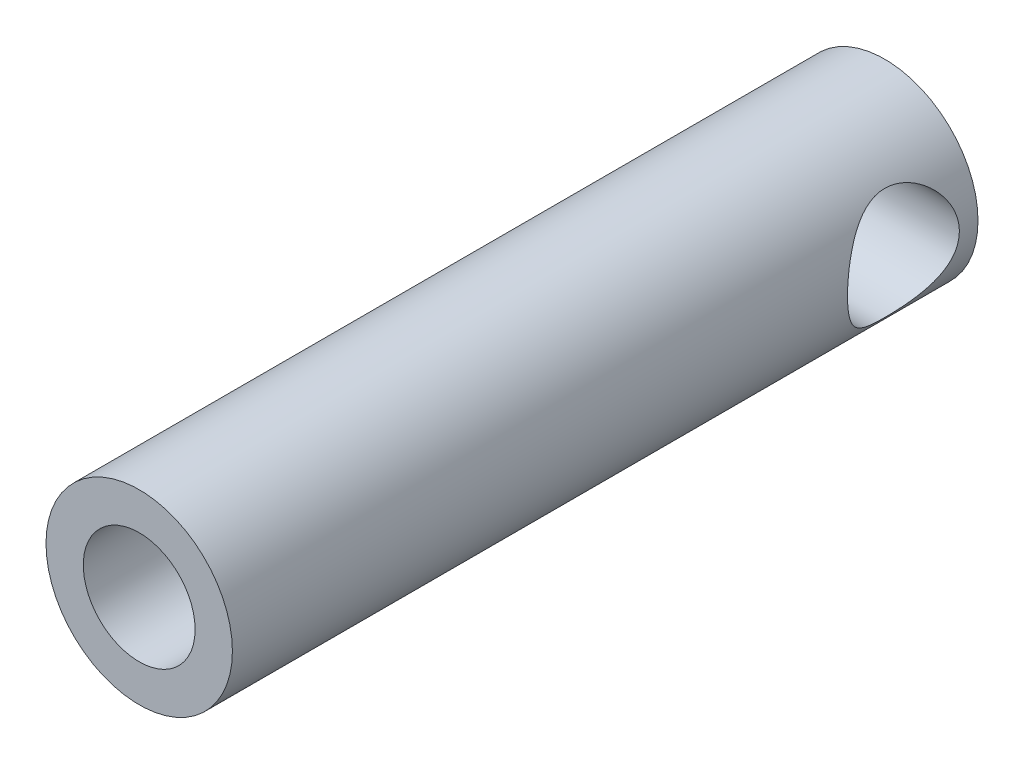
ISO-10303-21;
HEADER;
FILE_DESCRIPTION(('STEP AP214'),'2;1');
FILE_NAME('part.step','',(''),(''),'','','');
FILE_SCHEMA(('AUTOMOTIVE_DESIGN { 1 0 10303 214 1 1 1 1 }'));
ENDSEC;
DATA;
#1=APPLICATION_CONTEXT('core data for automotive mechanical design processes');
#2=APPLICATION_PROTOCOL_DEFINITION('international standard','automotive_design',2000,#1);
#3=PRODUCT_CONTEXT('',#1,'mechanical');
#4=PRODUCT('Part','Part','',(#3));
#5=PRODUCT_RELATED_PRODUCT_CATEGORY('part','',(#4));
#6=PRODUCT_DEFINITION_FORMATION('','',#4);
#7=PRODUCT_DEFINITION_CONTEXT('part definition',#1,'design');
#8=PRODUCT_DEFINITION('design','',#6,#7);
#9=PRODUCT_DEFINITION_SHAPE('','',#8);
#10=(LENGTH_UNIT() NAMED_UNIT(*) SI_UNIT(.MILLI.,.METRE.));
#11=(NAMED_UNIT(*) PLANE_ANGLE_UNIT() SI_UNIT($,.RADIAN.));
#12=(NAMED_UNIT(*) SI_UNIT($,.STERADIAN.) SOLID_ANGLE_UNIT());
#13=UNCERTAINTY_MEASURE_WITH_UNIT(LENGTH_MEASURE(1.E-05),#10,'distance_accuracy_value','');
#14=(GEOMETRIC_REPRESENTATION_CONTEXT(3) GLOBAL_UNCERTAINTY_ASSIGNED_CONTEXT((#13)) GLOBAL_UNIT_ASSIGNED_CONTEXT((#10,
#11,#12)) REPRESENTATION_CONTEXT('',''));
#15=CARTESIAN_POINT('',(0.,0.,0.));
#16=DIRECTION('',(0.,0.,1.));
#17=DIRECTION('',(1.,0.,0.));
#18=AXIS2_PLACEMENT_3D('',#15,#16,#17);
#19=CARTESIAN_POINT('',(0.,0.,25.4));
#20=DIRECTION('',(0.,0.,-1.));
#21=DIRECTION('',(-1.,0.,0.));
#22=AXIS2_PLACEMENT_3D('',#19,#20,#21);
#23=CYLINDRICAL_SURFACE('',#22,3.175);
#24=CARTESIAN_POINT('',(-3.175,0.,0.635000000000001));
#25=CARTESIAN_POINT('',(-3.17499451441265,0.0974450951319126,0.63500604758345));
#26=CARTESIAN_POINT('',(-3.17046469197759,0.195049066210574,0.642529640595864));
#27=CARTESIAN_POINT('',(-3.15277397294736,0.387319379299164,0.672241656700714));
#28=CARTESIAN_POINT('',(-3.1395917927214,0.481977872867109,0.694466243302083));
#29=CARTESIAN_POINT('',(-3.10593173484526,0.665164692998141,0.75233073963353));
#30=CARTESIAN_POINT('',(-3.08549004648014,0.753720871389695,0.787904153237712));
#31=CARTESIAN_POINT('',(-3.03905118293813,0.92332853858211,0.871042606722666));
#32=CARTESIAN_POINT('',(-3.01305538723253,1.00438188370712,0.918604669514047));
#33=CARTESIAN_POINT('',(-2.95535807693063,1.16370007405065,1.02841403480305));
#34=CARTESIAN_POINT('',(-2.9233722597582,1.24127770273718,1.09150619441045));
#35=CARTESIAN_POINT('',(-2.85788657998362,1.3854210370008,1.22868334754602));
#36=CARTESIAN_POINT('',(-2.82438481576973,1.45197239462229,1.30278242985672));
#37=CARTESIAN_POINT('',(-2.75477055048952,1.5804514580127,1.47056285874753));
#38=CARTESIAN_POINT('',(-2.71884162474123,1.64081163277819,1.56553124925678));
#39=CARTESIAN_POINT('',(-2.65351642802893,1.74449025984648,1.76637514790839));
#40=CARTESIAN_POINT('',(-2.62410958890118,1.78783637021076,1.87223259820865));
#41=CARTESIAN_POINT('',(-2.582603796677,1.84709564172948,2.06577749234916));
#42=CARTESIAN_POINT('',(-2.56804011584291,1.86710570502368,2.15167971824034));
#43=CARTESIAN_POINT('',(-2.54749691535738,1.89504538873503,2.32639071909934));
#44=CARTESIAN_POINT('',(-2.54150672347695,1.90299002887476,2.41519573951681));
#45=CARTESIAN_POINT('',(-2.53899571528976,1.90633996170635,2.59335459765742));
#46=CARTESIAN_POINT('',(-2.54249348006119,1.90172064928612,2.68270916986874));
#47=CARTESIAN_POINT('',(-2.55845642033584,1.8801849680819,2.85912404479266));
#48=CARTESIAN_POINT('',(-2.57092834088936,1.86325934967552,2.94618257072616));
#49=CARTESIAN_POINT('',(-2.602905474192,1.81830880789855,3.11471340750279));
#50=CARTESIAN_POINT('',(-2.6223177379872,1.79043010805925,3.19624335848412));
#51=CARTESIAN_POINT('',(-2.66607355215555,1.72459728448968,3.35368263847869));
#52=CARTESIAN_POINT('',(-2.69041890951801,1.68663946719826,3.42958989394838));
#53=CARTESIAN_POINT('',(-2.74644265631611,1.59407838644418,3.58772980334597));
#54=CARTESIAN_POINT('',(-2.778658950837,1.53772519985107,3.66874817805276));
#55=CARTESIAN_POINT('',(-2.84391861700764,1.41339687835684,3.82101913425711));
#56=CARTESIAN_POINT('',(-2.8769627533293,1.34541063277735,3.89226226115016));
#57=CARTESIAN_POINT('',(-2.94558091297062,1.18848102966636,4.03302848691363));
#58=CARTESIAN_POINT('',(-2.98086572061036,1.09793745703529,4.10092817864031));
#59=CARTESIAN_POINT('',(-3.04510984111155,0.904590584082928,4.22036499994135));
#60=CARTESIAN_POINT('',(-3.07407253390404,0.801793880208324,4.27191087931324));
#61=CARTESIAN_POINT('',(-3.12077597924012,0.593340933290619,4.35347387215079));
#62=CARTESIAN_POINT('',(-3.13910925948424,0.488273882700444,4.38464370175921));
#63=CARTESIAN_POINT('',(-3.16507930373209,0.273110826833689,4.42850422070483));
#64=CARTESIAN_POINT('',(-3.17272889649977,0.163021017189871,4.44121707354704));
#65=CARTESIAN_POINT('',(-3.17615024375755,-0.0428175602592936,4.44691496655145));
#66=CARTESIAN_POINT('',(-3.17339372577143,-0.138483941241768,4.44234424595817));
#67=CARTESIAN_POINT('',(-3.15948964350552,-0.327443340522304,4.41905916659866));
#68=CARTESIAN_POINT('',(-3.14834224937908,-0.420736406907676,4.40034509463662));
#69=CARTESIAN_POINT('',(-3.11905386401582,-0.60017016384015,4.35032984032817));
#70=CARTESIAN_POINT('',(-3.10108950091445,-0.686429603679102,4.31934575667669));
#71=CARTESIAN_POINT('',(-3.05960628695813,-0.852507501340897,4.24601973201611));
#72=CARTESIAN_POINT('',(-3.03608634064869,-0.932324684704436,4.20367555078975));
#73=CARTESIAN_POINT('',(-2.98253780221448,-1.09220795378601,4.10393263640492));
#74=CARTESIAN_POINT('',(-2.95208709479649,-1.17144057107901,4.04542773707034));
#75=CARTESIAN_POINT('',(-2.88892317279908,-1.31956305976505,3.91745293026955));
#76=CARTESIAN_POINT('',(-2.85620735064672,-1.38844071148087,3.84797026333764));
#77=CARTESIAN_POINT('',(-2.78695688365568,-1.52313635853689,3.6894638046524));
#78=CARTESIAN_POINT('',(-2.75048017017815,-1.58738594929295,3.59907346545717));
#79=CARTESIAN_POINT('',(-2.68244551224696,-1.69983453424862,3.40713564880002));
#80=CARTESIAN_POINT('',(-2.6508824045697,-1.74805043804979,3.30560007676229));
#81=CARTESIAN_POINT('',(-2.60330834735535,-1.81791075064868,3.1162713616657));
#82=CARTESIAN_POINT('',(-2.58541087347737,-1.84304464157586,3.03024500328845));
#83=CARTESIAN_POINT('',(-2.55790199294049,-1.88104353179932,2.85428426085439));
#84=CARTESIAN_POINT('',(-2.54827910005326,-1.89392554099576,2.76435547676331));
#85=CARTESIAN_POINT('',(-2.53873567203593,-1.90670345557268,2.5827012764919));
#86=CARTESIAN_POINT('',(-2.53885162089827,-1.90655052898535,2.49097039160376));
#87=CARTESIAN_POINT('',(-2.54886101720432,-1.89314420926951,2.30899406699981));
#88=CARTESIAN_POINT('',(-2.5587597812328,-1.87988369266792,2.21874946213322));
#89=CARTESIAN_POINT('',(-2.5861414527098,-1.84201020214653,2.046619708888));
#90=CARTESIAN_POINT('',(-2.60323599038313,-1.81797495311049,1.96454128732839));
#91=CARTESIAN_POINT('',(-2.6429398744415,-1.75975320921641,1.80551168972072));
#92=CARTESIAN_POINT('',(-2.66555129712813,-1.7255628914025,1.72856245797827));
#93=CARTESIAN_POINT('',(-2.71796498194149,-1.641973268796,1.56931376885049));
#94=CARTESIAN_POINT('',(-2.74833827007409,-1.59104483080574,1.48800674821947));
#95=CARTESIAN_POINT('',(-2.81076560550976,-1.47797196871254,1.33428735770283));
#96=CARTESIAN_POINT('',(-2.84282102131499,-1.41581830868474,1.2618823953562));
#97=CARTESIAN_POINT('',(-2.911166300656,-1.27012155867849,1.11588407673515));
#98=CARTESIAN_POINT('',(-2.94729305640336,-1.18474305905472,1.04402665983158));
#99=CARTESIAN_POINT('',(-3.01454081025536,-1.00135779697776,0.915546598416998));
#100=CARTESIAN_POINT('',(-3.04566001243498,-0.903346526463,0.858929414835811));
#101=CARTESIAN_POINT('',(-3.09861734506511,-0.699890837030486,0.764808840804749));
#102=CARTESIAN_POINT('',(-3.12071031004625,-0.594765596238279,0.726773640664804));
#103=CARTESIAN_POINT('',(-3.14589516757997,-0.432421334693443,0.683880450684826));
#104=CARTESIAN_POINT('',(-3.15296108370877,-0.377590720023223,0.671947799415356));
#105=CARTESIAN_POINT('',(-3.16425617194088,-0.266820768171081,0.652944499058858));
#106=CARTESIAN_POINT('',(-3.16848770657979,-0.210882394483744,0.645869800609404));
#107=CARTESIAN_POINT('',(-3.17248369797034,-0.128982982915142,0.639196227796563));
#108=CARTESIAN_POINT('',(-3.17342617833636,-0.103222017768106,0.637623845301756));
#109=CARTESIAN_POINT('',(-3.17468506718656,-0.0516444234298964,0.635524911809246));
#110=CARTESIAN_POINT('',(-3.17500145395323,-0.0258277923389147,0.634998397089877));
#111=CARTESIAN_POINT('',(-3.175,0.,0.635000000000001));
#112=B_SPLINE_CURVE_WITH_KNOTS('',3,(#24,#25,#26,#27,#28,#29,#30,#31,#32,#33,#34,#35,#36,#37,
#38,#39,#40,#41,#42,#43,#44,#45,#46,#47,#48,#49,#50,#51,#52,#53,#54,#55,#56,#57,#58,#59,#60,#61,
#62,#63,#64,#65,#66,#67,#68,#69,#70,#71,#72,#73,#74,#75,#76,#77,#78,#79,#80,#81,#82,#83,#84,#85,
#86,#87,#88,#89,#90,#91,#92,#93,#94,#95,#96,#97,#98,#99,#100,#101,#102,#103,#104,#105,#106,#107,
#108,#109,#110,#111),.UNSPECIFIED.,.T.,.F.,(4,2,2,2,2,2,2,2,2,2,2,2,2,2,2,2,2,2,2,2,2,2,2,2,2,2,
2,2,2,2,2,2,2,2,2,2,2,2,2,2,2,2,2,4),(0.,0.292229841686784,0.585181236950415,0.876692283442015,
1.16813101145019,1.4818562023024,1.79598647577196,2.14863442751055,2.50070671678956,
2.76775963916654,3.03447984564054,3.30172277005822,3.56916676657818,3.83315549843373,
4.09724110458533,4.40749683935957,4.71805056900666,5.07188416513558,5.42552812879662,
5.7568692418463,6.08781214386159,6.37382015457481,6.65982236566588,6.9388708782601,
7.21797445986962,7.52603734589319,7.83446096403932,8.18307688283572,8.53132396622899,
8.80437389889659,9.07704418691314,9.35073600737339,9.6245766506777,9.8852240488055,
10.1459696943425,10.446748347664,10.7477756135016,11.0979497595491,11.4482492146062,
11.787830811676,11.9572649902265,12.1265577643592,12.2040105069734,12.2814659361677),.UNSPECIFIED.);
#113=CARTESIAN_POINT('',(-3.175,0.,0.635000000000001));
#114=VERTEX_POINT('',#113);
#115=EDGE_CURVE('E10',#114,#114,#112,.T.);
#116=ORIENTED_EDGE('',*,*,#115,.T.);
#117=EDGE_LOOP('',(#116));
#118=FACE_BOUND('',#117,.T.);
#119=CARTESIAN_POINT('',(3.175,0.,0.635000000000001));
#120=CARTESIAN_POINT('',(3.17499451441265,-0.0974450951319126,0.63500604758345));
#121=CARTESIAN_POINT('',(3.17046469197759,-0.195049066210574,0.642529640595864));
#122=CARTESIAN_POINT('',(3.15277397294736,-0.387319379299164,0.672241656700714));
#123=CARTESIAN_POINT('',(3.1395917927214,-0.481977872867109,0.694466243302083));
#124=CARTESIAN_POINT('',(3.10593173484526,-0.665164692998141,0.75233073963353));
#125=CARTESIAN_POINT('',(3.08549004648014,-0.753720871389695,0.787904153237712));
#126=CARTESIAN_POINT('',(3.03905118293813,-0.92332853858211,0.871042606722666));
#127=CARTESIAN_POINT('',(3.01305538723253,-1.00438188370712,0.918604669514047));
#128=CARTESIAN_POINT('',(2.95535807693063,-1.16370007405065,1.02841403480305));
#129=CARTESIAN_POINT('',(2.9233722597582,-1.24127770273718,1.09150619441045));
#130=CARTESIAN_POINT('',(2.85788657998362,-1.3854210370008,1.22868334754602));
#131=CARTESIAN_POINT('',(2.82438481576973,-1.45197239462229,1.30278242985672));
#132=CARTESIAN_POINT('',(2.75477055048952,-1.5804514580127,1.47056285874753));
#133=CARTESIAN_POINT('',(2.71884162474123,-1.64081163277819,1.56553124925678));
#134=CARTESIAN_POINT('',(2.65351642802893,-1.74449025984648,1.76637514790839));
#135=CARTESIAN_POINT('',(2.62410958890118,-1.78783637021076,1.87223259820865));
#136=CARTESIAN_POINT('',(2.582603796677,-1.84709564172948,2.06577749234916));
#137=CARTESIAN_POINT('',(2.56804011584291,-1.86710570502368,2.15167971824034));
#138=CARTESIAN_POINT('',(2.54749691535738,-1.89504538873503,2.32639071909934));
#139=CARTESIAN_POINT('',(2.54150672347695,-1.90299002887476,2.41519573951681));
#140=CARTESIAN_POINT('',(2.53899571528976,-1.90633996170635,2.59335459765742));
#141=CARTESIAN_POINT('',(2.54249348006119,-1.90172064928612,2.68270916986874));
#142=CARTESIAN_POINT('',(2.55845642033584,-1.8801849680819,2.85912404479266));
#143=CARTESIAN_POINT('',(2.57092834088936,-1.86325934967552,2.94618257072616));
#144=CARTESIAN_POINT('',(2.602905474192,-1.81830880789855,3.11471340750279));
#145=CARTESIAN_POINT('',(2.6223177379872,-1.79043010805925,3.19624335848412));
#146=CARTESIAN_POINT('',(2.66607355215555,-1.72459728448968,3.35368263847869));
#147=CARTESIAN_POINT('',(2.69041890951801,-1.68663946719826,3.42958989394838));
#148=CARTESIAN_POINT('',(2.74644265631611,-1.59407838644418,3.58772980334597));
#149=CARTESIAN_POINT('',(2.778658950837,-1.53772519985107,3.66874817805276));
#150=CARTESIAN_POINT('',(2.84391861700764,-1.41339687835684,3.82101913425711));
#151=CARTESIAN_POINT('',(2.8769627533293,-1.34541063277735,3.89226226115016));
#152=CARTESIAN_POINT('',(2.94558091297062,-1.18848102966636,4.03302848691363));
#153=CARTESIAN_POINT('',(2.98086572061036,-1.09793745703529,4.10092817864031));
#154=CARTESIAN_POINT('',(3.04510984111155,-0.904590584082928,4.22036499994135));
#155=CARTESIAN_POINT('',(3.07407253390404,-0.801793880208324,4.27191087931324));
#156=CARTESIAN_POINT('',(3.12077597924012,-0.593340933290619,4.35347387215079));
#157=CARTESIAN_POINT('',(3.13910925948424,-0.488273882700444,4.38464370175921));
#158=CARTESIAN_POINT('',(3.16507930373209,-0.273110826833689,4.42850422070483));
#159=CARTESIAN_POINT('',(3.17272889649977,-0.163021017189871,4.44121707354704));
#160=CARTESIAN_POINT('',(3.17615024375755,0.0428175602592936,4.44691496655145));
#161=CARTESIAN_POINT('',(3.17339372577143,0.138483941241768,4.44234424595817));
#162=CARTESIAN_POINT('',(3.15948964350552,0.327443340522304,4.41905916659866));
#163=CARTESIAN_POINT('',(3.14834224937908,0.420736406907676,4.40034509463662));
#164=CARTESIAN_POINT('',(3.11905386401582,0.60017016384015,4.35032984032817));
#165=CARTESIAN_POINT('',(3.10108950091445,0.686429603679102,4.31934575667669));
#166=CARTESIAN_POINT('',(3.05960628695813,0.852507501340897,4.24601973201611));
#167=CARTESIAN_POINT('',(3.03608634064869,0.932324684704436,4.20367555078975));
#168=CARTESIAN_POINT('',(2.98253780221448,1.09220795378601,4.10393263640492));
#169=CARTESIAN_POINT('',(2.95208709479649,1.17144057107901,4.04542773707034));
#170=CARTESIAN_POINT('',(2.88892317279908,1.31956305976505,3.91745293026955));
#171=CARTESIAN_POINT('',(2.85620735064672,1.38844071148087,3.84797026333764));
#172=CARTESIAN_POINT('',(2.78695688365568,1.52313635853689,3.6894638046524));
#173=CARTESIAN_POINT('',(2.75048017017815,1.58738594929295,3.59907346545717));
#174=CARTESIAN_POINT('',(2.68244551224696,1.69983453424862,3.40713564880002));
#175=CARTESIAN_POINT('',(2.6508824045697,1.74805043804979,3.30560007676229));
#176=CARTESIAN_POINT('',(2.60330834735535,1.81791075064868,3.1162713616657));
#177=CARTESIAN_POINT('',(2.58541087347737,1.84304464157586,3.03024500328845));
#178=CARTESIAN_POINT('',(2.55790199294049,1.88104353179932,2.85428426085439));
#179=CARTESIAN_POINT('',(2.54827910005326,1.89392554099576,2.76435547676331));
#180=CARTESIAN_POINT('',(2.53873567203593,1.90670345557268,2.5827012764919));
#181=CARTESIAN_POINT('',(2.53885162089827,1.90655052898535,2.49097039160376));
#182=CARTESIAN_POINT('',(2.54886101720432,1.89314420926951,2.30899406699981));
#183=CARTESIAN_POINT('',(2.5587597812328,1.87988369266792,2.21874946213322));
#184=CARTESIAN_POINT('',(2.5861414527098,1.84201020214653,2.046619708888));
#185=CARTESIAN_POINT('',(2.60323599038313,1.81797495311049,1.96454128732839));
#186=CARTESIAN_POINT('',(2.6429398744415,1.75975320921641,1.80551168972072));
#187=CARTESIAN_POINT('',(2.66555129712813,1.7255628914025,1.72856245797827));
#188=CARTESIAN_POINT('',(2.71796498194149,1.641973268796,1.56931376885049));
#189=CARTESIAN_POINT('',(2.74833827007409,1.59104483080574,1.48800674821947));
#190=CARTESIAN_POINT('',(2.81076560550976,1.47797196871254,1.33428735770283));
#191=CARTESIAN_POINT('',(2.84282102131499,1.41581830868474,1.2618823953562));
#192=CARTESIAN_POINT('',(2.911166300656,1.27012155867849,1.11588407673515));
#193=CARTESIAN_POINT('',(2.94729305640336,1.18474305905472,1.04402665983158));
#194=CARTESIAN_POINT('',(3.01454081025536,1.00135779697776,0.915546598416998));
#195=CARTESIAN_POINT('',(3.04566001243498,0.903346526463,0.858929414835811));
#196=CARTESIAN_POINT('',(3.09861734506511,0.699890837030486,0.764808840804749));
#197=CARTESIAN_POINT('',(3.12071031004625,0.594765596238279,0.726773640664804));
#198=CARTESIAN_POINT('',(3.14589516757997,0.432421334693443,0.683880450684826));
#199=CARTESIAN_POINT('',(3.15296108370877,0.377590720023223,0.671947799415356));
#200=CARTESIAN_POINT('',(3.16425617194088,0.266820768171081,0.652944499058858));
#201=CARTESIAN_POINT('',(3.16848770657979,0.210882394483744,0.645869800609404));
#202=CARTESIAN_POINT('',(3.17248369797034,0.128982982915142,0.639196227796563));
#203=CARTESIAN_POINT('',(3.17342617833636,0.103222017768106,0.637623845301756));
#204=CARTESIAN_POINT('',(3.17468506718656,0.0516444234298964,0.635524911809246));
#205=CARTESIAN_POINT('',(3.17500145395323,0.0258277923389147,0.634998397089877));
#206=CARTESIAN_POINT('',(3.175,0.,0.635000000000001));
#207=B_SPLINE_CURVE_WITH_KNOTS('',3,(#119,#120,#121,#122,#123,#124,#125,#126,#127,#128,#129,
#130,#131,#132,#133,#134,#135,#136,#137,#138,#139,#140,#141,#142,#143,#144,#145,#146,#147,#148,
#149,#150,#151,#152,#153,#154,#155,#156,#157,#158,#159,#160,#161,#162,#163,#164,#165,#166,#167,
#168,#169,#170,#171,#172,#173,#174,#175,#176,#177,#178,#179,#180,#181,#182,#183,#184,#185,#186,
#187,#188,#189,#190,#191,#192,#193,#194,#195,#196,#197,#198,#199,#200,#201,#202,#203,#204,#205,
#206),.UNSPECIFIED.,.T.,.F.,(4,2,2,2,2,2,2,2,2,2,2,2,2,2,2,2,2,2,2,2,2,2,2,2,2,2,2,2,2,2,2,2,2,
2,2,2,2,2,2,2,2,2,2,4),(0.,0.292229841686784,0.585181236950415,0.876692283442015,
1.16813101145019,1.4818562023024,1.79598647577196,2.14863442751055,2.50070671678956,
2.76775963916654,3.03447984564054,3.30172277005822,3.56916676657818,3.83315549843373,
4.09724110458533,4.40749683935957,4.71805056900666,5.07188416513558,5.42552812879662,
5.7568692418463,6.08781214386159,6.37382015457481,6.65982236566588,6.9388708782601,
7.21797445986962,7.52603734589319,7.83446096403932,8.18307688283572,8.53132396622899,
8.80437389889659,9.07704418691314,9.35073600737339,9.6245766506777,9.8852240488055,
10.1459696943425,10.446748347664,10.7477756135016,11.0979497595491,11.4482492146062,
11.787830811676,11.9572649902265,12.1265577643592,12.2040105069734,12.2814659361677),.UNSPECIFIED.);
#208=CARTESIAN_POINT('',(3.175,0.,0.635000000000001));
#209=VERTEX_POINT('',#208);
#210=EDGE_CURVE('E53',#209,#209,#207,.T.);
#211=ORIENTED_EDGE('',*,*,#210,.T.);
#212=EDGE_LOOP('',(#211));
#213=FACE_BOUND('',#212,.T.);
#214=CARTESIAN_POINT('',(0.,0.,25.4));
#215=DIRECTION('',(0.,0.,1.));
#216=DIRECTION('',(1.,0.,0.));
#217=AXIS2_PLACEMENT_3D('',#214,#215,#216);
#218=CIRCLE('',#217,3.175);
#219=CARTESIAN_POINT('',(3.175,0.,25.4));
#220=VERTEX_POINT('',#219);
#221=EDGE_CURVE('E58',#220,#220,#218,.T.);
#222=ORIENTED_EDGE('',*,*,#221,.F.);
#223=EDGE_LOOP('',(#222));
#224=FACE_BOUND('',#223,.T.);
#225=CARTESIAN_POINT('',(0.,0.,0.));
#226=DIRECTION('',(0.,0.,1.));
#227=DIRECTION('',(1.,0.,0.));
#228=AXIS2_PLACEMENT_3D('',#225,#226,#227);
#229=CIRCLE('',#228,3.175);
#230=CARTESIAN_POINT('',(3.175,0.,0.));
#231=VERTEX_POINT('',#230);
#232=EDGE_CURVE('E63',#231,#231,#229,.T.);
#233=ORIENTED_EDGE('',*,*,#232,.T.);
#234=EDGE_LOOP('',(#233));
#235=FACE_BOUND('',#234,.T.);
#236=ADVANCED_FACE('F41',(#118,#213,#224,#235),#23,.T.);
#237=CARTESIAN_POINT('',(0.,0.,25.4));
#238=DIRECTION('',(0.,0.,1.));
#239=DIRECTION('',(1.,0.,0.));
#240=AXIS2_PLACEMENT_3D('',#237,#238,#239);
#241=PLANE('',#240);
#242=CARTESIAN_POINT('',(0.,0.,25.4));
#243=DIRECTION('',(0.,0.,1.));
#244=DIRECTION('',(1.,0.,0.));
#245=AXIS2_PLACEMENT_3D('',#242,#243,#244);
#246=CIRCLE('',#245,1.905);
#247=CARTESIAN_POINT('',(1.905,0.,25.4));
#248=VERTEX_POINT('',#247);
#249=EDGE_CURVE('E103',#248,#248,#246,.T.);
#250=ORIENTED_EDGE('',*,*,#249,.F.);
#251=EDGE_LOOP('',(#250));
#252=FACE_BOUND('',#251,.T.);
#253=ORIENTED_EDGE('',*,*,#221,.T.);
#254=EDGE_LOOP('',(#253));
#255=FACE_BOUND('',#254,.T.);
#256=ADVANCED_FACE('F84',(#252,#255),#241,.T.);
#257=CARTESIAN_POINT('',(0.,0.,0.));
#258=DIRECTION('',(0.,0.,1.));
#259=DIRECTION('',(1.,0.,0.));
#260=AXIS2_PLACEMENT_3D('',#257,#258,#259);
#261=PLANE('',#260);
#262=ORIENTED_EDGE('',*,*,#232,.F.);
#263=EDGE_LOOP('',(#262));
#264=FACE_BOUND('',#263,.T.);
#265=ADVANCED_FACE('F82',(#264),#261,.F.);
#266=CARTESIAN_POINT('',(0.,0.,12.7));
#267=DIRECTION('',(0.,0.,1.));
#268=DIRECTION('',(1.,0.,0.));
#269=AXIS2_PLACEMENT_3D('',#266,#267,#268);
#270=CYLINDRICAL_SURFACE('',#269,1.905);
#271=CARTESIAN_POINT('',(0.,0.,12.7));
#272=DIRECTION('',(0.,0.,1.));
#273=DIRECTION('',(1.,0.,0.));
#274=AXIS2_PLACEMENT_3D('',#271,#272,#273);
#275=CIRCLE('',#274,1.905);
#276=CARTESIAN_POINT('',(1.905,0.,12.7));
#277=VERTEX_POINT('',#276);
#278=EDGE_CURVE('E100',#277,#277,#275,.T.);
#279=ORIENTED_EDGE('',*,*,#278,.F.);
#280=EDGE_LOOP('',(#279));
#281=FACE_BOUND('',#280,.T.);
#282=ORIENTED_EDGE('',*,*,#249,.T.);
#283=EDGE_LOOP('',(#282));
#284=FACE_BOUND('',#283,.T.);
#285=ADVANCED_FACE('F78',(#281,#284),#270,.F.);
#286=CARTESIAN_POINT('',(0.,0.,12.7));
#287=DIRECTION('',(0.,0.,1.));
#288=DIRECTION('',(1.,0.,0.));
#289=AXIS2_PLACEMENT_3D('',#286,#287,#288);
#290=PLANE('',#289);
#291=ORIENTED_EDGE('',*,*,#278,.T.);
#292=EDGE_LOOP('',(#291));
#293=FACE_BOUND('',#292,.T.);
#294=ADVANCED_FACE('F73',(#293),#290,.T.);
#295=CARTESIAN_POINT('',(-3.175,0.,2.54));
#296=DIRECTION('',(1.,0.,0.));
#297=DIRECTION('',(0.,0.,-1.));
#298=AXIS2_PLACEMENT_3D('',#295,#296,#297);
#299=CYLINDRICAL_SURFACE('',#298,1.905);
#300=ORIENTED_EDGE('',*,*,#210,.F.);
#301=EDGE_LOOP('',(#300));
#302=FACE_BOUND('',#301,.T.);
#303=ORIENTED_EDGE('',*,*,#115,.F.);
#304=EDGE_LOOP('',(#303));
#305=FACE_BOUND('',#304,.T.);
#306=ADVANCED_FACE('F69',(#302,#305),#299,.F.);
#307=CLOSED_SHELL('',(#236,#256,#265,#285,#294,#306));
#308=MANIFOLD_SOLID_BREP('B2',#307);
#309=ADVANCED_BREP_SHAPE_REPRESENTATION('',(#18,#308),#14);
#310=SHAPE_DEFINITION_REPRESENTATION(#9,#309);
ENDSEC;
END-ISO-10303-21;
